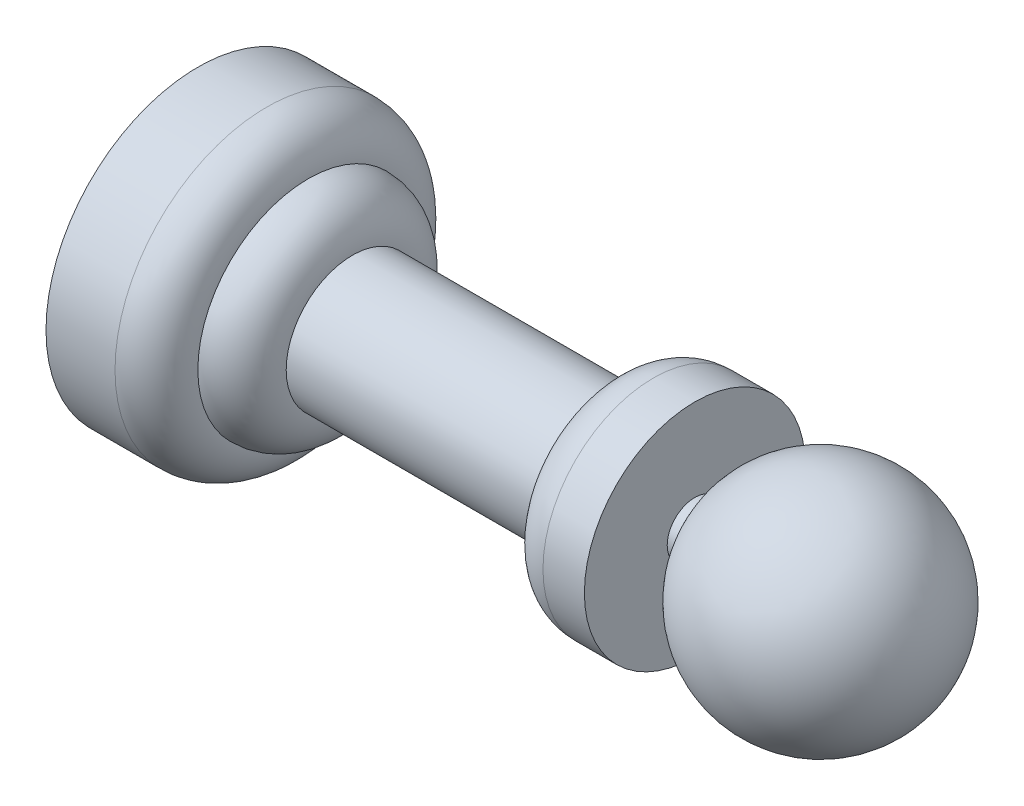
ISO-10303-21;
HEADER;
FILE_DESCRIPTION(('STEP AP214'),'2;1');
FILE_NAME('part.step','',(''),(''),'','','');
FILE_SCHEMA(('AUTOMOTIVE_DESIGN { 1 0 10303 214 1 1 1 1 }'));
ENDSEC;
DATA;
#1=APPLICATION_CONTEXT('core data for automotive mechanical design processes');
#2=APPLICATION_PROTOCOL_DEFINITION('international standard','automotive_design',2000,#1);
#3=PRODUCT_CONTEXT('',#1,'mechanical');
#4=PRODUCT('Part','Part','',(#3));
#5=PRODUCT_RELATED_PRODUCT_CATEGORY('part','',(#4));
#6=PRODUCT_DEFINITION_FORMATION('','',#4);
#7=PRODUCT_DEFINITION_CONTEXT('part definition',#1,'design');
#8=PRODUCT_DEFINITION('design','',#6,#7);
#9=PRODUCT_DEFINITION_SHAPE('','',#8);
#10=(LENGTH_UNIT() NAMED_UNIT(*) SI_UNIT(.MILLI.,.METRE.));
#11=(NAMED_UNIT(*) PLANE_ANGLE_UNIT() SI_UNIT($,.RADIAN.));
#12=(NAMED_UNIT(*) SI_UNIT($,.STERADIAN.) SOLID_ANGLE_UNIT());
#13=UNCERTAINTY_MEASURE_WITH_UNIT(LENGTH_MEASURE(1.E-05),#10,'distance_accuracy_value','');
#14=(GEOMETRIC_REPRESENTATION_CONTEXT(3) GLOBAL_UNCERTAINTY_ASSIGNED_CONTEXT((#13)) GLOBAL_UNIT_ASSIGNED_CONTEXT((#10,
#11,#12)) REPRESENTATION_CONTEXT('',''));
#15=CARTESIAN_POINT('',(0.,0.,0.));
#16=DIRECTION('',(0.,0.,1.));
#17=DIRECTION('',(1.,0.,0.));
#18=AXIS2_PLACEMENT_3D('',#15,#16,#17);
#19=CARTESIAN_POINT('',(33.,11.,0.));
#20=DIRECTION('',(-1.,0.,0.));
#21=DIRECTION('',(0.,0.,1.));
#22=AXIS2_PLACEMENT_3D('',#19,#20,#21);
#23=TOROIDAL_SURFACE('',#22,4.8,3.2);
#24=CARTESIAN_POINT('',(29.8,11.,0.));
#25=DIRECTION('',(-1.,0.,0.));
#26=DIRECTION('',(0.,0.,1.));
#27=AXIS2_PLACEMENT_3D('',#24,#25,#26);
#28=CIRCLE('',#27,4.8);
#29=CARTESIAN_POINT('',(29.8,11.,4.8));
#30=VERTEX_POINT('',#29);
#31=EDGE_CURVE('E82',#30,#30,#28,.T.);
#32=ORIENTED_EDGE('',*,*,#31,.F.);
#33=EDGE_LOOP('',(#32));
#34=FACE_BOUND('',#33,.T.);
#35=CARTESIAN_POINT('',(33.,11.,0.));
#36=DIRECTION('',(-1.,0.,0.));
#37=DIRECTION('',(0.,0.,1.));
#38=AXIS2_PLACEMENT_3D('',#35,#36,#37);
#39=CIRCLE('',#38,8.);
#40=CARTESIAN_POINT('',(33.,11.,8.));
#41=VERTEX_POINT('',#40);
#42=EDGE_CURVE('E10',#41,#41,#39,.T.);
#43=ORIENTED_EDGE('',*,*,#42,.T.);
#44=EDGE_LOOP('',(#43));
#45=FACE_BOUND('',#44,.T.);
#46=ADVANCED_FACE('F43',(#34,#45),#23,.T.);
#47=CARTESIAN_POINT('',(0.,11.,0.));
#48=DIRECTION('',(-1.,0.,0.));
#49=DIRECTION('',(0.,0.,1.));
#50=AXIS2_PLACEMENT_3D('',#47,#48,#49);
#51=CYLINDRICAL_SURFACE('',#50,8.);
#52=CARTESIAN_POINT('',(36.,11.,0.));
#53=DIRECTION('',(-1.,0.,0.));
#54=DIRECTION('',(0.,0.,1.));
#55=AXIS2_PLACEMENT_3D('',#52,#53,#54);
#56=CIRCLE('',#55,8.);
#57=CARTESIAN_POINT('',(36.,11.,8.));
#58=VERTEX_POINT('',#57);
#59=EDGE_CURVE('E50',#58,#58,#56,.T.);
#60=ORIENTED_EDGE('',*,*,#59,.T.);
#61=EDGE_LOOP('',(#60));
#62=FACE_BOUND('',#61,.T.);
#63=ORIENTED_EDGE('',*,*,#42,.F.);
#64=EDGE_LOOP('',(#63));
#65=FACE_BOUND('',#64,.T.);
#66=ADVANCED_FACE('F124',(#62,#65),#51,.T.);
#67=CARTESIAN_POINT('',(36.,0.,0.));
#68=DIRECTION('',(1.,0.,0.));
#69=DIRECTION('',(0.,0.,-1.));
#70=AXIS2_PLACEMENT_3D('',#67,#68,#69);
#71=PLANE('',#70);
#72=CARTESIAN_POINT('',(36.,11.,0.));
#73=DIRECTION('',(-1.,0.,0.));
#74=DIRECTION('',(0.,0.,1.));
#75=AXIS2_PLACEMENT_3D('',#72,#73,#74);
#76=CIRCLE('',#75,2.);
#77=CARTESIAN_POINT('',(36.,11.,2.));
#78=VERTEX_POINT('',#77);
#79=EDGE_CURVE('E55',#78,#78,#76,.T.);
#80=ORIENTED_EDGE('',*,*,#79,.T.);
#81=EDGE_LOOP('',(#80));
#82=FACE_BOUND('',#81,.T.);
#83=ORIENTED_EDGE('',*,*,#59,.F.);
#84=EDGE_LOOP('',(#83));
#85=FACE_BOUND('',#84,.T.);
#86=ADVANCED_FACE('F129',(#82,#85),#71,.T.);
#87=CARTESIAN_POINT('',(0.,11.,0.));
#88=DIRECTION('',(-1.,0.,0.));
#89=DIRECTION('',(0.,0.,1.));
#90=AXIS2_PLACEMENT_3D('',#87,#88,#89);
#91=CYLINDRICAL_SURFACE('',#90,2.);
#92=CARTESIAN_POINT('',(37.2708053836339,11.,0.));
#93=DIRECTION('',(-1.,0.,0.));
#94=DIRECTION('',(0.,0.,1.));
#95=AXIS2_PLACEMENT_3D('',#92,#93,#94);
#96=CIRCLE('',#95,2.);
#97=CARTESIAN_POINT('',(37.2708053836339,11.,2.));
#98=VERTEX_POINT('',#97);
#99=EDGE_CURVE('E60',#98,#98,#96,.T.);
#100=ORIENTED_EDGE('',*,*,#99,.T.);
#101=EDGE_LOOP('',(#100));
#102=FACE_BOUND('',#101,.T.);
#103=ORIENTED_EDGE('',*,*,#79,.F.);
#104=EDGE_LOOP('',(#103));
#105=FACE_BOUND('',#104,.T.);
#106=ADVANCED_FACE('F187',(#102,#105),#91,.T.);
#107=CARTESIAN_POINT('',(45.0979286611322,11.,0.));
#108=DIRECTION('',(-1.,0.,0.));
#109=DIRECTION('',(0.,-1.,0.));
#110=AXIS2_PLACEMENT_3D('',#107,#108,#109);
#111=SPHERICAL_SURFACE('',#110,8.07860500341206);
#112=ORIENTED_EDGE('',*,*,#99,.F.);
#113=EDGE_LOOP('',(#112));
#114=FACE_BOUND('',#113,.T.);
#115=ADVANCED_FACE('F108',(#114),#111,.T.);
#116=CARTESIAN_POINT('',(0.,0.,0.));
#117=DIRECTION('',(1.,0.,0.));
#118=DIRECTION('',(0.,0.,-1.));
#119=AXIS2_PLACEMENT_3D('',#116,#117,#118);
#120=PLANE('',#119);
#121=CARTESIAN_POINT('',(0.,11.,0.));
#122=DIRECTION('',(-1.,0.,0.));
#123=DIRECTION('',(0.,0.,1.));
#124=AXIS2_PLACEMENT_3D('',#121,#122,#123);
#125=CIRCLE('',#124,10.);
#126=CARTESIAN_POINT('',(0.,11.,10.));
#127=VERTEX_POINT('',#126);
#128=EDGE_CURVE('E87',#127,#127,#125,.T.);
#129=ORIENTED_EDGE('',*,*,#128,.F.);
#130=EDGE_LOOP('',(#129));
#131=FACE_BOUND('',#130,.T.);
#132=CARTESIAN_POINT('',(0.,11.,0.));
#133=DIRECTION('',(-1.,0.,0.));
#134=DIRECTION('',(0.,0.,1.));
#135=AXIS2_PLACEMENT_3D('',#132,#133,#134);
#136=CIRCLE('',#135,11.);
#137=CARTESIAN_POINT('',(0.,11.,11.));
#138=VERTEX_POINT('',#137);
#139=EDGE_CURVE('E66',#138,#138,#136,.T.);
#140=ORIENTED_EDGE('',*,*,#139,.T.);
#141=EDGE_LOOP('',(#140));
#142=FACE_BOUND('',#141,.T.);
#143=ADVANCED_FACE('F104',(#131,#142),#120,.F.);
#144=CARTESIAN_POINT('',(0.,11.,0.));
#145=DIRECTION('',(-1.,0.,0.));
#146=DIRECTION('',(0.,0.,1.));
#147=AXIS2_PLACEMENT_3D('',#144,#145,#146);
#148=CYLINDRICAL_SURFACE('',#147,11.);
#149=CARTESIAN_POINT('',(5.,11.,0.));
#150=DIRECTION('',(-1.,0.,0.));
#151=DIRECTION('',(0.,0.,1.));
#152=AXIS2_PLACEMENT_3D('',#149,#150,#151);
#153=CIRCLE('',#152,11.);
#154=CARTESIAN_POINT('',(5.,11.,11.));
#155=VERTEX_POINT('',#154);
#156=EDGE_CURVE('E70',#155,#155,#153,.T.);
#157=ORIENTED_EDGE('',*,*,#156,.T.);
#158=EDGE_LOOP('',(#157));
#159=FACE_BOUND('',#158,.T.);
#160=ORIENTED_EDGE('',*,*,#139,.F.);
#161=EDGE_LOOP('',(#160));
#162=FACE_BOUND('',#161,.T.);
#163=ADVANCED_FACE('F107',(#159,#162),#148,.T.);
#164=CARTESIAN_POINT('',(5.,11.,0.));
#165=DIRECTION('',(-1.,0.,0.));
#166=DIRECTION('',(0.,0.,1.));
#167=AXIS2_PLACEMENT_3D('',#164,#165,#166);
#168=TOROIDAL_SURFACE('',#167,8.,3.);
#169=CARTESIAN_POINT('',(8.,11.,0.));
#170=DIRECTION('',(-1.,0.,0.));
#171=DIRECTION('',(0.,0.,1.));
#172=AXIS2_PLACEMENT_3D('',#169,#170,#171);
#173=CIRCLE('',#172,8.);
#174=CARTESIAN_POINT('',(8.,11.,8.));
#175=VERTEX_POINT('',#174);
#176=EDGE_CURVE('E74',#175,#175,#173,.T.);
#177=ORIENTED_EDGE('',*,*,#176,.T.);
#178=EDGE_LOOP('',(#177));
#179=FACE_BOUND('',#178,.T.);
#180=ORIENTED_EDGE('',*,*,#156,.F.);
#181=EDGE_LOOP('',(#180));
#182=FACE_BOUND('',#181,.T.);
#183=ADVANCED_FACE('F113',(#179,#182),#168,.T.);
#184=CARTESIAN_POINT('',(8.,11.,0.));
#185=DIRECTION('',(-1.,0.,0.));
#186=DIRECTION('',(0.,0.,1.));
#187=AXIS2_PLACEMENT_3D('',#184,#185,#186);
#188=TOROIDAL_SURFACE('',#187,4.8,3.2);
#189=CARTESIAN_POINT('',(11.2,11.,0.));
#190=DIRECTION('',(-1.,0.,0.));
#191=DIRECTION('',(0.,0.,1.));
#192=AXIS2_PLACEMENT_3D('',#189,#190,#191);
#193=CIRCLE('',#192,4.8);
#194=CARTESIAN_POINT('',(11.2,11.,4.8));
#195=VERTEX_POINT('',#194);
#196=EDGE_CURVE('E78',#195,#195,#193,.T.);
#197=ORIENTED_EDGE('',*,*,#196,.T.);
#198=EDGE_LOOP('',(#197));
#199=FACE_BOUND('',#198,.T.);
#200=ORIENTED_EDGE('',*,*,#176,.F.);
#201=EDGE_LOOP('',(#200));
#202=FACE_BOUND('',#201,.T.);
#203=ADVANCED_FACE('F120',(#199,#202),#188,.T.);
#204=CARTESIAN_POINT('',(0.,11.,0.));
#205=DIRECTION('',(-1.,0.,0.));
#206=DIRECTION('',(0.,0.,1.));
#207=AXIS2_PLACEMENT_3D('',#204,#205,#206);
#208=CYLINDRICAL_SURFACE('',#207,4.8);
#209=ORIENTED_EDGE('',*,*,#31,.T.);
#210=EDGE_LOOP('',(#209));
#211=FACE_BOUND('',#210,.T.);
#212=ORIENTED_EDGE('',*,*,#196,.F.);
#213=EDGE_LOOP('',(#212));
#214=FACE_BOUND('',#213,.T.);
#215=ADVANCED_FACE('F100',(#211,#214),#208,.T.);
#216=CARTESIAN_POINT('',(2.5,11.,0.));
#217=DIRECTION('',(-1.,0.,0.));
#218=DIRECTION('',(0.,0.,1.));
#219=AXIS2_PLACEMENT_3D('',#216,#217,#218);
#220=CYLINDRICAL_SURFACE('',#219,10.);
#221=CARTESIAN_POINT('',(2.5,11.,0.));
#222=DIRECTION('',(-1.,0.,0.));
#223=DIRECTION('',(0.,0.,1.));
#224=AXIS2_PLACEMENT_3D('',#221,#222,#223);
#225=CIRCLE('',#224,10.);
#226=CARTESIAN_POINT('',(2.5,11.,10.));
#227=VERTEX_POINT('',#226);
#228=EDGE_CURVE('E86',#227,#227,#225,.T.);
#229=ORIENTED_EDGE('',*,*,#228,.F.);
#230=EDGE_LOOP('',(#229));
#231=FACE_BOUND('',#230,.T.);
#232=ORIENTED_EDGE('',*,*,#128,.T.);
#233=EDGE_LOOP('',(#232));
#234=FACE_BOUND('',#233,.T.);
#235=ADVANCED_FACE('F97',(#231,#234),#220,.F.);
#236=CARTESIAN_POINT('',(2.5,11.,0.));
#237=DIRECTION('',(-1.,0.,0.));
#238=DIRECTION('',(0.,0.,1.));
#239=AXIS2_PLACEMENT_3D('',#236,#237,#238);
#240=PLANE('',#239);
#241=ORIENTED_EDGE('',*,*,#228,.T.);
#242=EDGE_LOOP('',(#241));
#243=FACE_BOUND('',#242,.T.);
#244=ADVANCED_FACE('F95',(#243),#240,.T.);
#245=CLOSED_SHELL('',(#46,#66,#86,#106,#115,#143,#163,#183,#203,#215,#235,#244));
#246=MANIFOLD_SOLID_BREP('B2',#245);
#247=ADVANCED_BREP_SHAPE_REPRESENTATION('',(#18,#246),#14);
#248=SHAPE_DEFINITION_REPRESENTATION(#9,#247);
ENDSEC;
END-ISO-10303-21;
